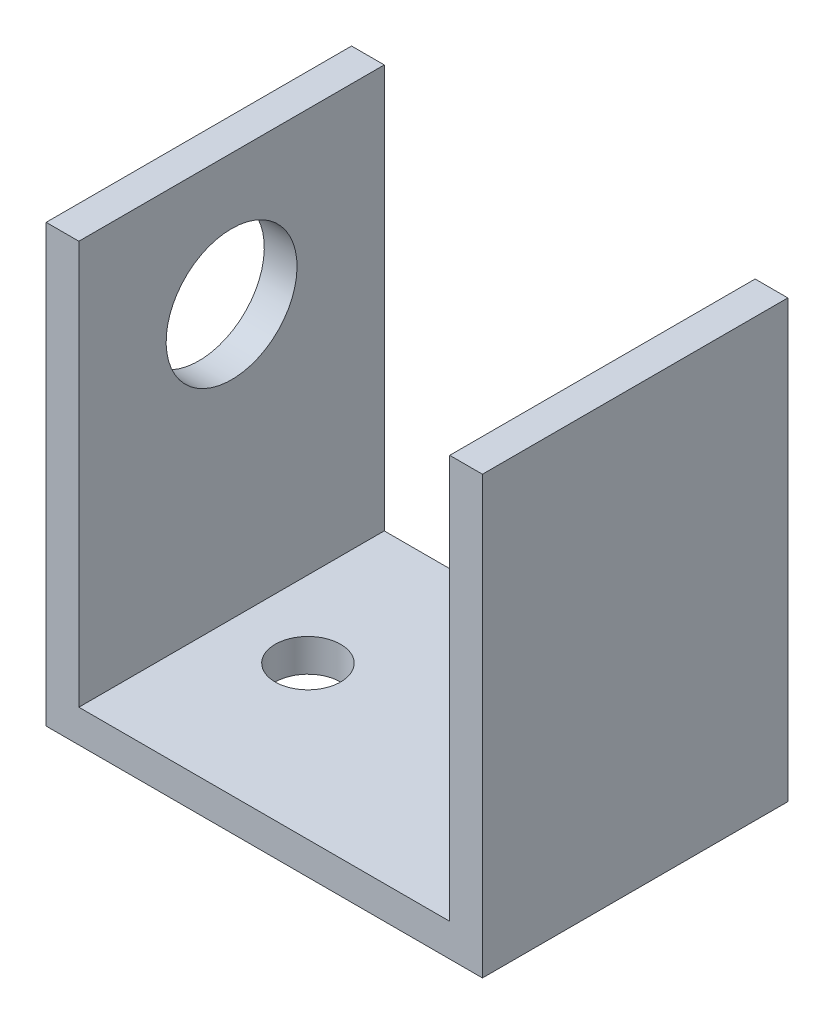
ISO-10303-21;
HEADER;
FILE_DESCRIPTION(('STEP AP214'),'2;1');
FILE_NAME('part.step','',(''),(''),'','','');
FILE_SCHEMA(('AUTOMOTIVE_DESIGN { 1 0 10303 214 1 1 1 1 }'));
ENDSEC;
DATA;
#1=APPLICATION_CONTEXT('core data for automotive mechanical design processes');
#2=APPLICATION_PROTOCOL_DEFINITION('international standard','automotive_design',2000,#1);
#3=PRODUCT_CONTEXT('',#1,'mechanical');
#4=PRODUCT('Part','Part','',(#3));
#5=PRODUCT_RELATED_PRODUCT_CATEGORY('part','',(#4));
#6=PRODUCT_DEFINITION_FORMATION('','',#4);
#7=PRODUCT_DEFINITION_CONTEXT('part definition',#1,'design');
#8=PRODUCT_DEFINITION('design','',#6,#7);
#9=PRODUCT_DEFINITION_SHAPE('','',#8);
#10=(LENGTH_UNIT() NAMED_UNIT(*) SI_UNIT(.MILLI.,.METRE.));
#11=(NAMED_UNIT(*) PLANE_ANGLE_UNIT() SI_UNIT($,.RADIAN.));
#12=(NAMED_UNIT(*) SI_UNIT($,.STERADIAN.) SOLID_ANGLE_UNIT());
#13=UNCERTAINTY_MEASURE_WITH_UNIT(LENGTH_MEASURE(1.E-05),#10,'distance_accuracy_value','');
#14=(GEOMETRIC_REPRESENTATION_CONTEXT(3) GLOBAL_UNCERTAINTY_ASSIGNED_CONTEXT((#13)) GLOBAL_UNIT_ASSIGNED_CONTEXT((#10,
#11,#12)) REPRESENTATION_CONTEXT('',''));
#15=CARTESIAN_POINT('',(0.,0.,0.));
#16=DIRECTION('',(0.,0.,1.));
#17=DIRECTION('',(1.,0.,0.));
#18=AXIS2_PLACEMENT_3D('',#15,#16,#17);
#19=CARTESIAN_POINT('',(-31.1485585296292,-16.6161569826708,14.));
#20=DIRECTION('',(1.,0.,0.));
#21=DIRECTION('',(0.,0.,-1.));
#22=AXIS2_PLACEMENT_3D('',#19,#20,#21);
#23=PLANE('',#22);
#24=CARTESIAN_POINT('',(-31.1485585296292,-2.61615698267076,7.));
#25=DIRECTION('',(1.,0.,0.));
#26=DIRECTION('',(0.,1.,0.));
#27=AXIS2_PLACEMENT_3D('',#24,#25,#26);
#28=CIRCLE('',#27,3.);
#29=CARTESIAN_POINT('',(-31.1485585296292,0.383843017329243,7.));
#30=VERTEX_POINT('',#29);
#31=EDGE_CURVE('E183',#30,#30,#28,.T.);
#32=ORIENTED_EDGE('',*,*,#31,.T.);
#33=EDGE_LOOP('',(#32));
#34=FACE_BOUND('',#33,.T.);
#35=DIRECTION('',(0.,-1.,0.));
#36=VECTOR('',#35,1.);
#37=CARTESIAN_POINT('',(-31.1485585296292,-16.6161569826708,0.));
#38=LINE('',#37,#36);
#39=CARTESIAN_POINT('',(-31.1485585296292,3.38384301732924,0.));
#40=VERTEX_POINT('',#39);
#41=CARTESIAN_POINT('',(-31.1485585296292,-16.6161569826708,0.));
#42=VERTEX_POINT('',#41);
#43=EDGE_CURVE('E126',#40,#42,#38,.T.);
#44=ORIENTED_EDGE('',*,*,#43,.T.);
#45=DIRECTION('',(0.,0.,-1.));
#46=VECTOR('',#45,1.);
#47=CARTESIAN_POINT('',(-31.1485585296292,-16.6161569826708,14.));
#48=LINE('',#47,#46);
#49=CARTESIAN_POINT('',(-31.1485585296292,-16.6161569826708,14.));
#50=VERTEX_POINT('',#49);
#51=EDGE_CURVE('E11',#50,#42,#48,.T.);
#52=ORIENTED_EDGE('',*,*,#51,.F.);
#53=DIRECTION('',(0.,-1.,0.));
#54=VECTOR('',#53,1.);
#55=CARTESIAN_POINT('',(-31.1485585296292,-16.6161569826708,14.));
#56=LINE('',#55,#54);
#57=CARTESIAN_POINT('',(-31.1485585296292,3.38384301732924,14.));
#58=VERTEX_POINT('',#57);
#59=EDGE_CURVE('E141',#58,#50,#56,.T.);
#60=ORIENTED_EDGE('',*,*,#59,.F.);
#61=DIRECTION('',(0.,0.,-1.));
#62=VECTOR('',#61,1.);
#63=CARTESIAN_POINT('',(-31.1485585296292,3.38384301732924,14.));
#64=LINE('',#63,#62);
#65=EDGE_CURVE('E122',#58,#40,#64,.T.);
#66=ORIENTED_EDGE('',*,*,#65,.T.);
#67=EDGE_LOOP('',(#44,#52,#60,#66));
#68=FACE_BOUND('',#67,.T.);
#69=ADVANCED_FACE('F30',(#34,#68),#23,.F.);
#70=CARTESIAN_POINT('',(-11.1485585296292,-16.6161569826708,14.));
#71=DIRECTION('',(0.,1.,0.));
#72=DIRECTION('',(-1.,0.,0.));
#73=AXIS2_PLACEMENT_3D('',#70,#71,#72);
#74=PLANE('',#73);
#75=CARTESIAN_POINT('',(-16.1485585296292,-16.6161569826708,7.));
#76=DIRECTION('',(0.,1.,0.));
#77=DIRECTION('',(-1.,0.,0.));
#78=AXIS2_PLACEMENT_3D('',#75,#76,#77);
#79=CIRCLE('',#78,1.5);
#80=CARTESIAN_POINT('',(-17.6485585296292,-16.6161569826708,7.));
#81=VERTEX_POINT('',#80);
#82=EDGE_CURVE('E177',#81,#81,#79,.T.);
#83=ORIENTED_EDGE('',*,*,#82,.T.);
#84=EDGE_LOOP('',(#83));
#85=FACE_BOUND('',#84,.T.);
#86=CARTESIAN_POINT('',(-26.1485585296292,-16.6161569826708,7.));
#87=DIRECTION('',(0.,1.,0.));
#88=DIRECTION('',(-1.,0.,0.));
#89=AXIS2_PLACEMENT_3D('',#86,#87,#88);
#90=CIRCLE('',#89,1.5);
#91=CARTESIAN_POINT('',(-27.6485585296292,-16.6161569826708,7.));
#92=VERTEX_POINT('',#91);
#93=EDGE_CURVE('E130',#92,#92,#90,.T.);
#94=ORIENTED_EDGE('',*,*,#93,.T.);
#95=EDGE_LOOP('',(#94));
#96=FACE_BOUND('',#95,.T.);
#97=DIRECTION('',(1.,0.,0.));
#98=VECTOR('',#97,1.);
#99=CARTESIAN_POINT('',(-11.1485585296292,-16.6161569826708,0.));
#100=LINE('',#99,#98);
#101=CARTESIAN_POINT('',(-11.1485585296292,-16.6161569826708,0.));
#102=VERTEX_POINT('',#101);
#103=EDGE_CURVE('E129',#42,#102,#100,.T.);
#104=ORIENTED_EDGE('',*,*,#103,.T.);
#105=DIRECTION('',(0.,0.,-1.));
#106=VECTOR('',#105,1.);
#107=CARTESIAN_POINT('',(-11.1485585296292,-16.6161569826708,14.));
#108=LINE('',#107,#106);
#109=CARTESIAN_POINT('',(-11.1485585296292,-16.6161569826708,14.));
#110=VERTEX_POINT('',#109);
#111=EDGE_CURVE('E38',#110,#102,#108,.T.);
#112=ORIENTED_EDGE('',*,*,#111,.F.);
#113=DIRECTION('',(1.,0.,0.));
#114=VECTOR('',#113,1.);
#115=CARTESIAN_POINT('',(-11.1485585296292,-16.6161569826708,14.));
#116=LINE('',#115,#114);
#117=EDGE_CURVE('E89',#50,#110,#116,.T.);
#118=ORIENTED_EDGE('',*,*,#117,.F.);
#119=ORIENTED_EDGE('',*,*,#51,.T.);
#120=EDGE_LOOP('',(#104,#112,#118,#119));
#121=FACE_BOUND('',#120,.T.);
#122=ADVANCED_FACE('F212',(#85,#96,#121),#74,.F.);
#123=CARTESIAN_POINT('',(-11.1485585296292,3.38384301732925,14.));
#124=DIRECTION('',(-1.,0.,0.));
#125=DIRECTION('',(0.,-1.,0.));
#126=AXIS2_PLACEMENT_3D('',#123,#124,#125);
#127=PLANE('',#126);
#128=DIRECTION('',(0.,1.,0.));
#129=VECTOR('',#128,1.);
#130=CARTESIAN_POINT('',(-11.1485585296292,3.38384301732925,0.));
#131=LINE('',#130,#129);
#132=CARTESIAN_POINT('',(-11.1485585296292,3.38384301732925,0.));
#133=VERTEX_POINT('',#132);
#134=EDGE_CURVE('E132',#102,#133,#131,.T.);
#135=ORIENTED_EDGE('',*,*,#134,.T.);
#136=DIRECTION('',(0.,0.,-1.));
#137=VECTOR('',#136,1.);
#138=CARTESIAN_POINT('',(-11.1485585296292,3.38384301732925,14.));
#139=LINE('',#138,#137);
#140=CARTESIAN_POINT('',(-11.1485585296292,3.38384301732925,14.));
#141=VERTEX_POINT('',#140);
#142=EDGE_CURVE('E148',#141,#133,#139,.T.);
#143=ORIENTED_EDGE('',*,*,#142,.F.);
#144=DIRECTION('',(0.,1.,0.));
#145=VECTOR('',#144,1.);
#146=CARTESIAN_POINT('',(-11.1485585296292,3.38384301732925,14.));
#147=LINE('',#146,#145);
#148=EDGE_CURVE('E156',#110,#141,#147,.T.);
#149=ORIENTED_EDGE('',*,*,#148,.F.);
#150=ORIENTED_EDGE('',*,*,#111,.T.);
#151=EDGE_LOOP('',(#135,#143,#149,#150));
#152=FACE_BOUND('',#151,.T.);
#153=ADVANCED_FACE('F154',(#152),#127,.F.);
#154=CARTESIAN_POINT('',(-12.6485585296292,3.38384301732925,14.));
#155=DIRECTION('',(0.,-1.,0.));
#156=DIRECTION('',(0.,0.,-1.));
#157=AXIS2_PLACEMENT_3D('',#154,#155,#156);
#158=PLANE('',#157);
#159=DIRECTION('',(-1.,0.,0.));
#160=VECTOR('',#159,1.);
#161=CARTESIAN_POINT('',(-12.6485585296292,3.38384301732925,0.));
#162=LINE('',#161,#160);
#163=CARTESIAN_POINT('',(-12.6485585296292,3.38384301732925,0.));
#164=VERTEX_POINT('',#163);
#165=EDGE_CURVE('E134',#133,#164,#162,.T.);
#166=ORIENTED_EDGE('',*,*,#165,.T.);
#167=DIRECTION('',(0.,0.,-1.));
#168=VECTOR('',#167,1.);
#169=CARTESIAN_POINT('',(-12.6485585296292,3.38384301732925,14.));
#170=LINE('',#169,#168);
#171=CARTESIAN_POINT('',(-12.6485585296292,3.38384301732925,14.));
#172=VERTEX_POINT('',#171);
#173=EDGE_CURVE('E145',#172,#164,#170,.T.);
#174=ORIENTED_EDGE('',*,*,#173,.F.);
#175=DIRECTION('',(-1.,0.,0.));
#176=VECTOR('',#175,1.);
#177=CARTESIAN_POINT('',(-12.6485585296292,3.38384301732925,14.));
#178=LINE('',#177,#176);
#179=EDGE_CURVE('E168',#141,#172,#178,.T.);
#180=ORIENTED_EDGE('',*,*,#179,.F.);
#181=ORIENTED_EDGE('',*,*,#142,.T.);
#182=EDGE_LOOP('',(#166,#174,#180,#181));
#183=FACE_BOUND('',#182,.T.);
#184=ADVANCED_FACE('F164',(#183),#158,.F.);
#185=CARTESIAN_POINT('',(-12.6485585296292,-15.1161569826708,14.));
#186=DIRECTION('',(1.,0.,0.));
#187=DIRECTION('',(0.,0.,-1.));
#188=AXIS2_PLACEMENT_3D('',#185,#186,#187);
#189=PLANE('',#188);
#190=DIRECTION('',(0.,-1.,0.));
#191=VECTOR('',#190,1.);
#192=CARTESIAN_POINT('',(-12.6485585296292,-15.1161569826708,0.));
#193=LINE('',#192,#191);
#194=CARTESIAN_POINT('',(-12.6485585296292,-15.1161569826708,0.));
#195=VERTEX_POINT('',#194);
#196=EDGE_CURVE('E136',#164,#195,#193,.T.);
#197=ORIENTED_EDGE('',*,*,#196,.T.);
#198=DIRECTION('',(0.,0.,-1.));
#199=VECTOR('',#198,1.);
#200=CARTESIAN_POINT('',(-12.6485585296292,-15.1161569826708,14.));
#201=LINE('',#200,#199);
#202=CARTESIAN_POINT('',(-12.6485585296292,-15.1161569826708,14.));
#203=VERTEX_POINT('',#202);
#204=EDGE_CURVE('E117',#203,#195,#201,.T.);
#205=ORIENTED_EDGE('',*,*,#204,.F.);
#206=DIRECTION('',(0.,-1.,0.));
#207=VECTOR('',#206,1.);
#208=CARTESIAN_POINT('',(-12.6485585296292,-15.1161569826708,14.));
#209=LINE('',#208,#207);
#210=EDGE_CURVE('E108',#172,#203,#209,.T.);
#211=ORIENTED_EDGE('',*,*,#210,.F.);
#212=ORIENTED_EDGE('',*,*,#173,.T.);
#213=EDGE_LOOP('',(#197,#205,#211,#212));
#214=FACE_BOUND('',#213,.T.);
#215=ADVANCED_FACE('F167',(#214),#189,.F.);
#216=CARTESIAN_POINT('',(-29.6485585296292,-15.1161569826708,14.));
#217=DIRECTION('',(0.,-1.,0.));
#218=DIRECTION('',(0.,0.,-1.));
#219=AXIS2_PLACEMENT_3D('',#216,#217,#218);
#220=PLANE('',#219);
#221=CARTESIAN_POINT('',(-16.1485585296292,-15.1161569826708,7.));
#222=DIRECTION('',(0.,1.,0.));
#223=DIRECTION('',(-1.,0.,0.));
#224=AXIS2_PLACEMENT_3D('',#221,#222,#223);
#225=CIRCLE('',#224,1.5);
#226=CARTESIAN_POINT('',(-17.6485585296292,-15.1161569826708,7.));
#227=VERTEX_POINT('',#226);
#228=EDGE_CURVE('E180',#227,#227,#225,.T.);
#229=ORIENTED_EDGE('',*,*,#228,.F.);
#230=EDGE_LOOP('',(#229));
#231=FACE_BOUND('',#230,.T.);
#232=CARTESIAN_POINT('',(-26.1485585296292,-15.1161569826708,7.));
#233=DIRECTION('',(0.,1.,0.));
#234=DIRECTION('',(-1.,0.,0.));
#235=AXIS2_PLACEMENT_3D('',#232,#233,#234);
#236=CIRCLE('',#235,1.5);
#237=CARTESIAN_POINT('',(-27.6485585296292,-15.1161569826708,7.));
#238=VERTEX_POINT('',#237);
#239=EDGE_CURVE('E174',#238,#238,#236,.T.);
#240=ORIENTED_EDGE('',*,*,#239,.F.);
#241=EDGE_LOOP('',(#240));
#242=FACE_BOUND('',#241,.T.);
#243=DIRECTION('',(-1.,0.,0.));
#244=VECTOR('',#243,1.);
#245=CARTESIAN_POINT('',(-29.6485585296292,-15.1161569826708,0.));
#246=LINE('',#245,#244);
#247=CARTESIAN_POINT('',(-29.6485585296292,-15.1161569826708,0.));
#248=VERTEX_POINT('',#247);
#249=EDGE_CURVE('E116',#195,#248,#246,.T.);
#250=ORIENTED_EDGE('',*,*,#249,.T.);
#251=DIRECTION('',(0.,0.,-1.));
#252=VECTOR('',#251,1.);
#253=CARTESIAN_POINT('',(-29.6485585296292,-15.1161569826708,14.));
#254=LINE('',#253,#252);
#255=CARTESIAN_POINT('',(-29.6485585296292,-15.1161569826708,14.));
#256=VERTEX_POINT('',#255);
#257=EDGE_CURVE('E113',#256,#248,#254,.T.);
#258=ORIENTED_EDGE('',*,*,#257,.F.);
#259=DIRECTION('',(-1.,0.,0.));
#260=VECTOR('',#259,1.);
#261=CARTESIAN_POINT('',(-29.6485585296292,-15.1161569826708,14.));
#262=LINE('',#261,#260);
#263=EDGE_CURVE('E102',#203,#256,#262,.T.);
#264=ORIENTED_EDGE('',*,*,#263,.F.);
#265=ORIENTED_EDGE('',*,*,#204,.T.);
#266=EDGE_LOOP('',(#250,#258,#264,#265));
#267=FACE_BOUND('',#266,.T.);
#268=ADVANCED_FACE('F114',(#231,#242,#267),#220,.F.);
#269=CARTESIAN_POINT('',(-29.6485585296292,3.38384301732924,14.));
#270=DIRECTION('',(-1.,0.,0.));
#271=DIRECTION('',(0.,-1.,0.));
#272=AXIS2_PLACEMENT_3D('',#269,#270,#271);
#273=PLANE('',#272);
#274=CARTESIAN_POINT('',(-29.6485585296292,-2.61615698267076,7.));
#275=DIRECTION('',(1.,0.,0.));
#276=DIRECTION('',(0.,1.,0.));
#277=AXIS2_PLACEMENT_3D('',#274,#275,#276);
#278=CIRCLE('',#277,3.);
#279=CARTESIAN_POINT('',(-29.6485585296292,0.383843017329243,7.));
#280=VERTEX_POINT('',#279);
#281=EDGE_CURVE('E186',#280,#280,#278,.T.);
#282=ORIENTED_EDGE('',*,*,#281,.F.);
#283=EDGE_LOOP('',(#282));
#284=FACE_BOUND('',#283,.T.);
#285=DIRECTION('',(0.,1.,0.));
#286=VECTOR('',#285,1.);
#287=CARTESIAN_POINT('',(-29.6485585296292,3.38384301732924,0.));
#288=LINE('',#287,#286);
#289=CARTESIAN_POINT('',(-29.6485585296292,3.38384301732924,0.));
#290=VERTEX_POINT('',#289);
#291=EDGE_CURVE('E75',#248,#290,#288,.T.);
#292=ORIENTED_EDGE('',*,*,#291,.T.);
#293=DIRECTION('',(0.,0.,-1.));
#294=VECTOR('',#293,1.);
#295=CARTESIAN_POINT('',(-29.6485585296292,3.38384301732924,14.));
#296=LINE('',#295,#294);
#297=CARTESIAN_POINT('',(-29.6485585296292,3.38384301732924,14.));
#298=VERTEX_POINT('',#297);
#299=EDGE_CURVE('E118',#298,#290,#296,.T.);
#300=ORIENTED_EDGE('',*,*,#299,.F.);
#301=DIRECTION('',(0.,1.,0.));
#302=VECTOR('',#301,1.);
#303=CARTESIAN_POINT('',(-29.6485585296292,3.38384301732924,14.));
#304=LINE('',#303,#302);
#305=EDGE_CURVE('E106',#256,#298,#304,.T.);
#306=ORIENTED_EDGE('',*,*,#305,.F.);
#307=ORIENTED_EDGE('',*,*,#257,.T.);
#308=EDGE_LOOP('',(#292,#300,#306,#307));
#309=FACE_BOUND('',#308,.T.);
#310=ADVANCED_FACE('F120',(#284,#309),#273,.F.);
#311=CARTESIAN_POINT('',(-31.1485585296292,3.38384301732924,14.));
#312=DIRECTION('',(0.,-1.,0.));
#313=DIRECTION('',(0.,0.,-1.));
#314=AXIS2_PLACEMENT_3D('',#311,#312,#313);
#315=PLANE('',#314);
#316=DIRECTION('',(-1.,0.,0.));
#317=VECTOR('',#316,1.);
#318=CARTESIAN_POINT('',(-31.1485585296292,3.38384301732924,0.));
#319=LINE('',#318,#317);
#320=EDGE_CURVE('E81',#290,#40,#319,.T.);
#321=ORIENTED_EDGE('',*,*,#320,.T.);
#322=ORIENTED_EDGE('',*,*,#65,.F.);
#323=DIRECTION('',(-1.,0.,0.));
#324=VECTOR('',#323,1.);
#325=CARTESIAN_POINT('',(-31.1485585296292,3.38384301732924,14.));
#326=LINE('',#325,#324);
#327=EDGE_CURVE('E46',#298,#58,#326,.T.);
#328=ORIENTED_EDGE('',*,*,#327,.F.);
#329=ORIENTED_EDGE('',*,*,#299,.T.);
#330=EDGE_LOOP('',(#321,#322,#328,#329));
#331=FACE_BOUND('',#330,.T.);
#332=ADVANCED_FACE('F202',(#331),#315,.F.);
#333=CARTESIAN_POINT('',(-31.1485585296292,3.38384301732924,14.));
#334=DIRECTION('',(0.,0.,-1.));
#335=DIRECTION('',(-1.,0.,0.));
#336=AXIS2_PLACEMENT_3D('',#333,#334,#335);
#337=PLANE('',#336);
#338=ORIENTED_EDGE('',*,*,#59,.T.);
#339=ORIENTED_EDGE('',*,*,#117,.T.);
#340=ORIENTED_EDGE('',*,*,#148,.T.);
#341=ORIENTED_EDGE('',*,*,#179,.T.);
#342=ORIENTED_EDGE('',*,*,#210,.T.);
#343=ORIENTED_EDGE('',*,*,#263,.T.);
#344=ORIENTED_EDGE('',*,*,#305,.T.);
#345=ORIENTED_EDGE('',*,*,#327,.T.);
#346=EDGE_LOOP('',(#338,#339,#340,#341,#342,#343,#344,#345));
#347=FACE_BOUND('',#346,.T.);
#348=ADVANCED_FACE('F104',(#347),#337,.F.);
#349=CARTESIAN_POINT('',(-31.1485585296292,3.38384301732924,0.));
#350=DIRECTION('',(0.,0.,-1.));
#351=DIRECTION('',(-1.,0.,0.));
#352=AXIS2_PLACEMENT_3D('',#349,#350,#351);
#353=PLANE('',#352);
#354=ORIENTED_EDGE('',*,*,#43,.F.);
#355=ORIENTED_EDGE('',*,*,#320,.F.);
#356=ORIENTED_EDGE('',*,*,#291,.F.);
#357=ORIENTED_EDGE('',*,*,#249,.F.);
#358=ORIENTED_EDGE('',*,*,#196,.F.);
#359=ORIENTED_EDGE('',*,*,#165,.F.);
#360=ORIENTED_EDGE('',*,*,#134,.F.);
#361=ORIENTED_EDGE('',*,*,#103,.F.);
#362=EDGE_LOOP('',(#354,#355,#356,#357,#358,#359,#360,#361));
#363=FACE_BOUND('',#362,.T.);
#364=ADVANCED_FACE('F160',(#363),#353,.T.);
#365=CARTESIAN_POINT('',(-26.1485585296292,-16.6161569826708,7.));
#366=DIRECTION('',(0.,1.,0.));
#367=DIRECTION('',(-1.,0.,0.));
#368=AXIS2_PLACEMENT_3D('',#365,#366,#367);
#369=CYLINDRICAL_SURFACE('',#368,1.5);
#370=ORIENTED_EDGE('',*,*,#93,.F.);
#371=EDGE_LOOP('',(#370));
#372=FACE_BOUND('',#371,.T.);
#373=ORIENTED_EDGE('',*,*,#239,.T.);
#374=EDGE_LOOP('',(#373));
#375=FACE_BOUND('',#374,.T.);
#376=ADVANCED_FACE('F244',(#372,#375),#369,.F.);
#377=CARTESIAN_POINT('',(-16.1485585296292,-16.6161569826708,7.));
#378=DIRECTION('',(0.,1.,0.));
#379=DIRECTION('',(-1.,0.,0.));
#380=AXIS2_PLACEMENT_3D('',#377,#378,#379);
#381=CYLINDRICAL_SURFACE('',#380,1.5);
#382=ORIENTED_EDGE('',*,*,#82,.F.);
#383=EDGE_LOOP('',(#382));
#384=FACE_BOUND('',#383,.T.);
#385=ORIENTED_EDGE('',*,*,#228,.T.);
#386=EDGE_LOOP('',(#385));
#387=FACE_BOUND('',#386,.T.);
#388=ADVANCED_FACE('F197',(#384,#387),#381,.F.);
#389=CARTESIAN_POINT('',(-31.1485585296292,-2.61615698267076,7.));
#390=DIRECTION('',(1.,0.,0.));
#391=DIRECTION('',(0.,1.,0.));
#392=AXIS2_PLACEMENT_3D('',#389,#390,#391);
#393=CYLINDRICAL_SURFACE('',#392,3.);
#394=ORIENTED_EDGE('',*,*,#31,.F.);
#395=EDGE_LOOP('',(#394));
#396=FACE_BOUND('',#395,.T.);
#397=ORIENTED_EDGE('',*,*,#281,.T.);
#398=EDGE_LOOP('',(#397));
#399=FACE_BOUND('',#398,.T.);
#400=ADVANCED_FACE('F194',(#396,#399),#393,.F.);
#401=CLOSED_SHELL('',(#69,#122,#153,#184,#215,#268,#310,#332,#348,#364,#376,#388,#400));
#402=MANIFOLD_SOLID_BREP('B2',#401);
#403=ADVANCED_BREP_SHAPE_REPRESENTATION('',(#18,#402),#14);
#404=SHAPE_DEFINITION_REPRESENTATION(#9,#403);
ENDSEC;
END-ISO-10303-21;
